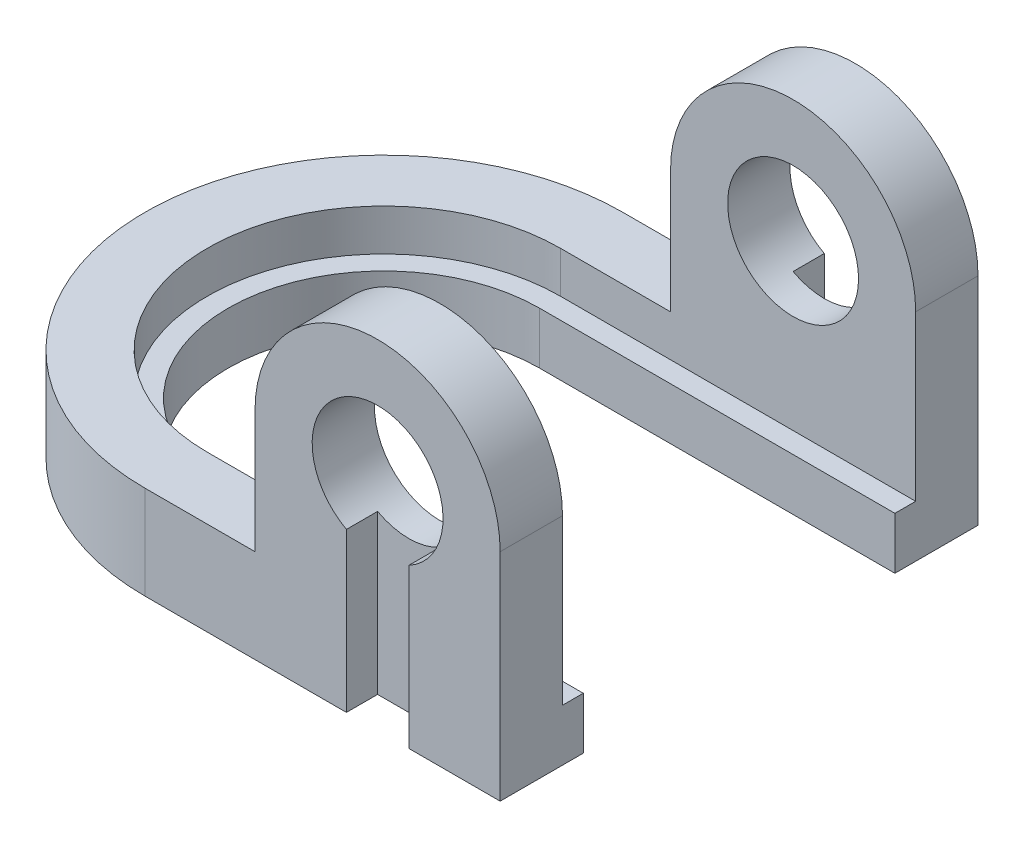
ISO-10303-21;
HEADER;
FILE_DESCRIPTION(('STEP AP214'),'2;1');
FILE_NAME('part.step','',(''),(''),'','','');
FILE_SCHEMA(('AUTOMOTIVE_DESIGN { 1 0 10303 214 1 1 1 1 }'));
ENDSEC;
DATA;
#1=APPLICATION_CONTEXT('core data for automotive mechanical design processes');
#2=APPLICATION_PROTOCOL_DEFINITION('international standard','automotive_design',2000,#1);
#3=PRODUCT_CONTEXT('',#1,'mechanical');
#4=PRODUCT('Part','Part','',(#3));
#5=PRODUCT_RELATED_PRODUCT_CATEGORY('part','',(#4));
#6=PRODUCT_DEFINITION_FORMATION('','',#4);
#7=PRODUCT_DEFINITION_CONTEXT('part definition',#1,'design');
#8=PRODUCT_DEFINITION('design','',#6,#7);
#9=PRODUCT_DEFINITION_SHAPE('','',#8);
#10=(LENGTH_UNIT() NAMED_UNIT(*) SI_UNIT(.MILLI.,.METRE.));
#11=(NAMED_UNIT(*) PLANE_ANGLE_UNIT() SI_UNIT($,.RADIAN.));
#12=(NAMED_UNIT(*) SI_UNIT($,.STERADIAN.) SOLID_ANGLE_UNIT());
#13=UNCERTAINTY_MEASURE_WITH_UNIT(LENGTH_MEASURE(1.E-05),#10,'distance_accuracy_value','');
#14=(GEOMETRIC_REPRESENTATION_CONTEXT(3) GLOBAL_UNCERTAINTY_ASSIGNED_CONTEXT((#13)) GLOBAL_UNIT_ASSIGNED_CONTEXT((#10,
#11,#12)) REPRESENTATION_CONTEXT('',''));
#15=CARTESIAN_POINT('',(0.,0.,0.));
#16=DIRECTION('',(0.,0.,1.));
#17=DIRECTION('',(1.,0.,0.));
#18=AXIS2_PLACEMENT_3D('',#15,#16,#17);
#19=CARTESIAN_POINT('',(0.,25.,115.));
#20=DIRECTION('',(0.,0.,-1.));
#21=DIRECTION('',(-1.,0.,0.));
#22=AXIS2_PLACEMENT_3D('',#19,#20,#21);
#23=PLANE('',#22);
#24=DIRECTION('',(0.,-1.,0.));
#25=VECTOR('',#24,1.);
#26=CARTESIAN_POINT('',(127.,-86.4238975695762,115.));
#27=LINE('',#26,#25);
#28=CARTESIAN_POINT('',(127.,76.3007220310709,115.));
#29=VERTEX_POINT('',#28);
#30=CARTESIAN_POINT('',(127.,0.,115.));
#31=VERTEX_POINT('',#30);
#32=EDGE_CURVE('E204',#29,#31,#27,.T.);
#33=ORIENTED_EDGE('',*,*,#32,.T.);
#34=DIRECTION('',(1.,0.,0.));
#35=VECTOR('',#34,1.);
#36=CARTESIAN_POINT('',(0.,0.,115.));
#37=LINE('',#36,#35);
#38=CARTESIAN_POINT('',(171.,0.,115.));
#39=VERTEX_POINT('',#38);
#40=EDGE_CURVE('E352',#31,#39,#37,.T.);
#41=ORIENTED_EDGE('',*,*,#40,.T.);
#42=DIRECTION('',(0.,-1.,0.));
#43=VECTOR('',#42,1.);
#44=CARTESIAN_POINT('',(171.,25.,115.));
#45=LINE('',#44,#43);
#46=CARTESIAN_POINT('',(171.,104.,115.));
#47=VERTEX_POINT('',#46);
#48=EDGE_CURVE('E332',#47,#39,#45,.T.);
#49=ORIENTED_EDGE('',*,*,#48,.F.);
#50=CARTESIAN_POINT('',(112.,104.,115.));
#51=DIRECTION('',(0.,0.,1.));
#52=DIRECTION('',(1.,0.,0.));
#53=AXIS2_PLACEMENT_3D('',#50,#51,#52);
#54=CIRCLE('',#53,59.);
#55=CARTESIAN_POINT('',(53.,104.,115.));
#56=VERTEX_POINT('',#55);
#57=EDGE_CURVE('E234',#47,#56,#54,.T.);
#58=ORIENTED_EDGE('',*,*,#57,.T.);
#59=DIRECTION('',(0.,-1.,0.));
#60=VECTOR('',#59,1.);
#61=CARTESIAN_POINT('',(53.,25.,115.));
#62=LINE('',#61,#60);
#63=CARTESIAN_POINT('',(53.,45.,115.));
#64=VERTEX_POINT('',#63);
#65=EDGE_CURVE('E231',#56,#64,#62,.T.);
#66=ORIENTED_EDGE('',*,*,#65,.T.);
#67=DIRECTION('',(1.,0.,0.));
#68=VECTOR('',#67,1.);
#69=CARTESIAN_POINT('',(0.,45.,115.));
#70=LINE('',#69,#68);
#71=CARTESIAN_POINT('',(0.,45.,115.));
#72=VERTEX_POINT('',#71);
#73=EDGE_CURVE('E288',#72,#64,#70,.T.);
#74=ORIENTED_EDGE('',*,*,#73,.F.);
#75=DIRECTION('',(0.,-1.,0.));
#76=VECTOR('',#75,1.);
#77=CARTESIAN_POINT('',(0.,25.,115.));
#78=LINE('',#77,#76);
#79=CARTESIAN_POINT('',(0.,0.,115.));
#80=VERTEX_POINT('',#79);
#81=EDGE_CURVE('E356',#72,#80,#78,.T.);
#82=ORIENTED_EDGE('',*,*,#81,.T.);
#83=CARTESIAN_POINT('',(97.,0.,115.));
#84=VERTEX_POINT('',#83);
#85=EDGE_CURVE('E321',#80,#84,#37,.T.);
#86=ORIENTED_EDGE('',*,*,#85,.T.);
#87=DIRECTION('',(0.,1.,0.));
#88=VECTOR('',#87,1.);
#89=CARTESIAN_POINT('',(97.,-86.4238975695762,115.));
#90=LINE('',#89,#88);
#91=CARTESIAN_POINT('',(97.,76.3007220310709,115.));
#92=VERTEX_POINT('',#91);
#93=EDGE_CURVE('E212',#84,#92,#90,.T.);
#94=ORIENTED_EDGE('',*,*,#93,.T.);
#95=CARTESIAN_POINT('',(112.,104.,115.));
#96=DIRECTION('',(0.,0.,1.));
#97=DIRECTION('',(1.,0.,0.));
#98=AXIS2_PLACEMENT_3D('',#95,#96,#97);
#99=CIRCLE('',#98,31.5);
#100=EDGE_CURVE('E218',#29,#92,#99,.T.);
#101=ORIENTED_EDGE('',*,*,#100,.F.);
#102=EDGE_LOOP('',(#33,#41,#49,#58,#66,#74,#82,#86,#94,#101));
#103=FACE_BOUND('',#102,.T.);
#104=ADVANCED_FACE('F43',(#103),#23,.F.);
#105=CARTESIAN_POINT('',(0.,0.,0.));
#106=DIRECTION('',(0.,1.,0.));
#107=DIRECTION('',(0.,0.,1.));
#108=AXIS2_PLACEMENT_3D('',#105,#106,#107);
#109=PLANE('',#108);
#110=DIRECTION('',(0.,0.,1.));
#111=VECTOR('',#110,1.);
#112=CARTESIAN_POINT('',(127.,0.,0.));
#113=LINE('',#112,#111);
#114=CARTESIAN_POINT('',(127.,0.,100.));
#115=VERTEX_POINT('',#114);
#116=EDGE_CURVE('E208',#115,#31,#113,.T.);
#117=ORIENTED_EDGE('',*,*,#116,.F.);
#118=DIRECTION('',(1.,0.,0.));
#119=VECTOR('',#118,1.);
#120=CARTESIAN_POINT('',(0.,0.,100.));
#121=LINE('',#120,#119);
#122=CARTESIAN_POINT('',(97.,0.,100.));
#123=VERTEX_POINT('',#122);
#124=EDGE_CURVE('E394',#123,#115,#121,.T.);
#125=ORIENTED_EDGE('',*,*,#124,.F.);
#126=DIRECTION('',(0.,0.,-1.));
#127=VECTOR('',#126,1.);
#128=CARTESIAN_POINT('',(97.,0.,0.));
#129=LINE('',#128,#127);
#130=EDGE_CURVE('E392',#84,#123,#129,.T.);
#131=ORIENTED_EDGE('',*,*,#130,.F.);
#132=ORIENTED_EDGE('',*,*,#85,.F.);
#133=CARTESIAN_POINT('',(0.,0.,0.));
#134=DIRECTION('',(0.,1.,0.));
#135=DIRECTION('',(0.,0.,1.));
#136=AXIS2_PLACEMENT_3D('',#133,#134,#135);
#137=CIRCLE('',#136,115.);
#138=CARTESIAN_POINT('',(0.,0.,-115.));
#139=VERTEX_POINT('',#138);
#140=EDGE_CURVE('E350',#139,#80,#137,.T.);
#141=ORIENTED_EDGE('',*,*,#140,.F.);
#142=DIRECTION('',(1.,0.,0.));
#143=VECTOR('',#142,1.);
#144=CARTESIAN_POINT('',(0.,0.,-115.));
#145=LINE('',#144,#143);
#146=CARTESIAN_POINT('',(97.,0.,-115.));
#147=VERTEX_POINT('',#146);
#148=EDGE_CURVE('E347',#139,#147,#145,.T.);
#149=ORIENTED_EDGE('',*,*,#148,.T.);
#150=DIRECTION('',(0.,0.,1.));
#151=VECTOR('',#150,1.);
#152=CARTESIAN_POINT('',(97.,0.,0.));
#153=LINE('',#152,#151);
#154=CARTESIAN_POINT('',(97.,0.,-100.));
#155=VERTEX_POINT('',#154);
#156=EDGE_CURVE('E253',#147,#155,#153,.T.);
#157=ORIENTED_EDGE('',*,*,#156,.T.);
#158=DIRECTION('',(-1.,0.,0.));
#159=VECTOR('',#158,1.);
#160=CARTESIAN_POINT('',(0.,0.,-100.));
#161=LINE('',#160,#159);
#162=CARTESIAN_POINT('',(127.,0.,-100.));
#163=VERTEX_POINT('',#162);
#164=EDGE_CURVE('E249',#163,#155,#161,.T.);
#165=ORIENTED_EDGE('',*,*,#164,.F.);
#166=DIRECTION('',(0.,0.,-1.));
#167=VECTOR('',#166,1.);
#168=CARTESIAN_POINT('',(127.,0.,0.));
#169=LINE('',#168,#167);
#170=CARTESIAN_POINT('',(127.,0.,-115.));
#171=VERTEX_POINT('',#170);
#172=EDGE_CURVE('E256',#163,#171,#169,.T.);
#173=ORIENTED_EDGE('',*,*,#172,.T.);
#174=CARTESIAN_POINT('',(171.,0.,-115.));
#175=VERTEX_POINT('',#174);
#176=EDGE_CURVE('E346',#171,#175,#145,.T.);
#177=ORIENTED_EDGE('',*,*,#176,.T.);
#178=DIRECTION('',(0.,0.,1.));
#179=VECTOR('',#178,1.);
#180=CARTESIAN_POINT('',(171.,0.,0.));
#181=LINE('',#180,#179);
#182=CARTESIAN_POINT('',(171.,0.,-75.));
#183=VERTEX_POINT('',#182);
#184=EDGE_CURVE('E344',#175,#183,#181,.T.);
#185=ORIENTED_EDGE('',*,*,#184,.T.);
#186=DIRECTION('',(1.,0.,0.));
#187=VECTOR('',#186,1.);
#188=CARTESIAN_POINT('',(0.,0.,-75.));
#189=LINE('',#188,#187);
#190=CARTESIAN_POINT('',(0.,0.,-75.));
#191=VERTEX_POINT('',#190);
#192=EDGE_CURVE('E341',#191,#183,#189,.T.);
#193=ORIENTED_EDGE('',*,*,#192,.F.);
#194=CARTESIAN_POINT('',(0.,0.,0.));
#195=DIRECTION('',(0.,1.,0.));
#196=DIRECTION('',(0.,0.,1.));
#197=AXIS2_PLACEMENT_3D('',#194,#195,#196);
#198=CIRCLE('',#197,75.);
#199=CARTESIAN_POINT('',(0.,0.,75.));
#200=VERTEX_POINT('',#199);
#201=EDGE_CURVE('E338',#191,#200,#198,.T.);
#202=ORIENTED_EDGE('',*,*,#201,.T.);
#203=DIRECTION('',(1.,0.,0.));
#204=VECTOR('',#203,1.);
#205=CARTESIAN_POINT('',(0.,0.,75.));
#206=LINE('',#205,#204);
#207=CARTESIAN_POINT('',(171.,0.,75.));
#208=VERTEX_POINT('',#207);
#209=EDGE_CURVE('E335',#200,#208,#206,.T.);
#210=ORIENTED_EDGE('',*,*,#209,.T.);
#211=DIRECTION('',(0.,0.,1.));
#212=VECTOR('',#211,1.);
#213=CARTESIAN_POINT('',(171.,0.,0.));
#214=LINE('',#213,#212);
#215=EDGE_CURVE('E316',#208,#39,#214,.T.);
#216=ORIENTED_EDGE('',*,*,#215,.T.);
#217=ORIENTED_EDGE('',*,*,#40,.F.);
#218=EDGE_LOOP('',(#117,#125,#131,#132,#141,#149,#157,#165,#173,#177,#185,#193,#202,#210,#216,#217));
#219=FACE_BOUND('',#218,.T.);
#220=ADVANCED_FACE('F400',(#219),#109,.F.);
#221=CARTESIAN_POINT('',(112.,104.,115.));
#222=DIRECTION('',(0.,0.,-1.));
#223=DIRECTION('',(-1.,0.,0.));
#224=AXIS2_PLACEMENT_3D('',#221,#222,#223);
#225=CYLINDRICAL_SURFACE('',#224,31.5);
#226=CARTESIAN_POINT('',(112.,104.,85.));
#227=DIRECTION('',(0.,0.,1.));
#228=DIRECTION('',(1.,0.,0.));
#229=AXIS2_PLACEMENT_3D('',#226,#227,#228);
#230=CIRCLE('',#229,31.5);
#231=CARTESIAN_POINT('',(143.5,104.,85.));
#232=VERTEX_POINT('',#231);
#233=EDGE_CURVE('E222',#232,#232,#230,.T.);
#234=ORIENTED_EDGE('',*,*,#233,.F.);
#235=EDGE_LOOP('',(#234));
#236=FACE_BOUND('',#235,.T.);
#237=CARTESIAN_POINT('',(112.,104.,100.));
#238=DIRECTION('',(0.,0.,1.));
#239=DIRECTION('',(1.,0.,0.));
#240=AXIS2_PLACEMENT_3D('',#237,#238,#239);
#241=CIRCLE('',#240,31.5);
#242=CARTESIAN_POINT('',(97.,76.3007220310709,100.));
#243=VERTEX_POINT('',#242);
#244=CARTESIAN_POINT('',(127.,76.3007220310709,100.));
#245=VERTEX_POINT('',#244);
#246=EDGE_CURVE('E219',#243,#245,#241,.T.);
#247=ORIENTED_EDGE('',*,*,#246,.T.);
#248=DIRECTION('',(0.,0.,-1.));
#249=VECTOR('',#248,1.);
#250=CARTESIAN_POINT('',(127.,76.3007220310709,115.));
#251=LINE('',#250,#249);
#252=EDGE_CURVE('E11',#245,#29,#251,.F.);
#253=ORIENTED_EDGE('',*,*,#252,.T.);
#254=ORIENTED_EDGE('',*,*,#100,.T.);
#255=DIRECTION('',(0.,0.,-1.));
#256=VECTOR('',#255,1.);
#257=CARTESIAN_POINT('',(97.,76.3007220310709,115.));
#258=LINE('',#257,#256);
#259=EDGE_CURVE('E51',#92,#243,#258,.T.);
#260=ORIENTED_EDGE('',*,*,#259,.T.);
#261=EDGE_LOOP('',(#247,#253,#254,#260));
#262=FACE_BOUND('',#261,.T.);
#263=ADVANCED_FACE('F216',(#236,#262),#225,.F.);
#264=CARTESIAN_POINT('',(0.,45.,0.));
#265=DIRECTION('',(0.,1.,0.));
#266=DIRECTION('',(0.,0.,1.));
#267=AXIS2_PLACEMENT_3D('',#264,#265,#266);
#268=PLANE('',#267);
#269=ORIENTED_EDGE('',*,*,#73,.T.);
#270=DIRECTION('',(0.,0.,-1.));
#271=VECTOR('',#270,1.);
#272=CARTESIAN_POINT('',(53.,45.,0.));
#273=LINE('',#272,#271);
#274=CARTESIAN_POINT('',(53.,45.,85.));
#275=VERTEX_POINT('',#274);
#276=EDGE_CURVE('E384',#64,#275,#273,.T.);
#277=ORIENTED_EDGE('',*,*,#276,.T.);
#278=DIRECTION('',(1.,0.,0.));
#279=VECTOR('',#278,1.);
#280=CARTESIAN_POINT('',(0.,45.,85.));
#281=LINE('',#280,#279);
#282=CARTESIAN_POINT('',(0.,45.,85.));
#283=VERTEX_POINT('',#282);
#284=EDGE_CURVE('E291',#283,#275,#281,.T.);
#285=ORIENTED_EDGE('',*,*,#284,.F.);
#286=CARTESIAN_POINT('',(0.,45.,0.));
#287=DIRECTION('',(0.,1.,0.));
#288=DIRECTION('',(0.,0.,1.));
#289=AXIS2_PLACEMENT_3D('',#286,#287,#288);
#290=CIRCLE('',#289,85.);
#291=CARTESIAN_POINT('',(0.,45.,-85.));
#292=VERTEX_POINT('',#291);
#293=EDGE_CURVE('E294',#292,#283,#290,.T.);
#294=ORIENTED_EDGE('',*,*,#293,.F.);
#295=DIRECTION('',(1.,0.,0.));
#296=VECTOR('',#295,1.);
#297=CARTESIAN_POINT('',(0.,45.,-85.));
#298=LINE('',#297,#296);
#299=CARTESIAN_POINT('',(53.,45.,-85.));
#300=VERTEX_POINT('',#299);
#301=EDGE_CURVE('E297',#292,#300,#298,.T.);
#302=ORIENTED_EDGE('',*,*,#301,.T.);
#303=DIRECTION('',(0.,0.,1.));
#304=VECTOR('',#303,1.);
#305=CARTESIAN_POINT('',(53.,45.,0.));
#306=LINE('',#305,#304);
#307=CARTESIAN_POINT('',(53.,45.,-115.));
#308=VERTEX_POINT('',#307);
#309=EDGE_CURVE('E373',#308,#300,#306,.T.);
#310=ORIENTED_EDGE('',*,*,#309,.F.);
#311=DIRECTION('',(1.,0.,0.));
#312=VECTOR('',#311,1.);
#313=CARTESIAN_POINT('',(0.,45.,-115.));
#314=LINE('',#313,#312);
#315=CARTESIAN_POINT('',(0.,45.,-115.));
#316=VERTEX_POINT('',#315);
#317=EDGE_CURVE('E280',#316,#308,#314,.T.);
#318=ORIENTED_EDGE('',*,*,#317,.F.);
#319=CARTESIAN_POINT('',(0.,45.,0.));
#320=DIRECTION('',(0.,1.,0.));
#321=DIRECTION('',(0.,0.,1.));
#322=AXIS2_PLACEMENT_3D('',#319,#320,#321);
#323=CIRCLE('',#322,115.);
#324=EDGE_CURVE('E285',#316,#72,#323,.T.);
#325=ORIENTED_EDGE('',*,*,#324,.T.);
#326=EDGE_LOOP('',(#269,#277,#285,#294,#302,#310,#318,#325));
#327=FACE_BOUND('',#326,.T.);
#328=ADVANCED_FACE('F412',(#327),#268,.T.);
#329=CARTESIAN_POINT('',(171.,25.,0.));
#330=DIRECTION('',(1.,0.,0.));
#331=DIRECTION('',(0.,0.,-1.));
#332=AXIS2_PLACEMENT_3D('',#329,#330,#331);
#333=PLANE('',#332);
#334=ORIENTED_EDGE('',*,*,#48,.T.);
#335=ORIENTED_EDGE('',*,*,#215,.F.);
#336=DIRECTION('',(0.,-1.,0.));
#337=VECTOR('',#336,1.);
#338=CARTESIAN_POINT('',(171.,25.,75.));
#339=LINE('',#338,#337);
#340=CARTESIAN_POINT('',(171.,25.,75.));
#341=VERTEX_POINT('',#340);
#342=EDGE_CURVE('E371',#341,#208,#339,.T.);
#343=ORIENTED_EDGE('',*,*,#342,.F.);
#344=DIRECTION('',(0.,0.,1.));
#345=VECTOR('',#344,1.);
#346=CARTESIAN_POINT('',(171.,25.,0.));
#347=LINE('',#346,#345);
#348=CARTESIAN_POINT('',(171.,25.,85.));
#349=VERTEX_POINT('',#348);
#350=EDGE_CURVE('E317',#341,#349,#347,.T.);
#351=ORIENTED_EDGE('',*,*,#350,.T.);
#352=DIRECTION('',(0.,-1.,0.));
#353=VECTOR('',#352,1.);
#354=CARTESIAN_POINT('',(171.,45.,85.));
#355=LINE('',#354,#353);
#356=CARTESIAN_POINT('',(171.,104.,85.));
#357=VERTEX_POINT('',#356);
#358=EDGE_CURVE('E307',#357,#349,#355,.T.);
#359=ORIENTED_EDGE('',*,*,#358,.F.);
#360=DIRECTION('',(0.,0.,-1.));
#361=VECTOR('',#360,1.);
#362=CARTESIAN_POINT('',(171.,104.,115.));
#363=LINE('',#362,#361);
#364=EDGE_CURVE('E238',#47,#357,#363,.T.);
#365=ORIENTED_EDGE('',*,*,#364,.F.);
#366=EDGE_LOOP('',(#334,#335,#343,#351,#359,#365));
#367=FACE_BOUND('',#366,.T.);
#368=ADVANCED_FACE('F45',(#367),#333,.T.);
#369=CARTESIAN_POINT('',(0.,25.,75.));
#370=DIRECTION('',(0.,0.,-1.));
#371=DIRECTION('',(-1.,0.,0.));
#372=AXIS2_PLACEMENT_3D('',#369,#370,#371);
#373=PLANE('',#372);
#374=ORIENTED_EDGE('',*,*,#209,.F.);
#375=DIRECTION('',(0.,-1.,0.));
#376=VECTOR('',#375,1.);
#377=CARTESIAN_POINT('',(0.,25.,75.));
#378=LINE('',#377,#376);
#379=CARTESIAN_POINT('',(0.,25.,75.));
#380=VERTEX_POINT('',#379);
#381=EDGE_CURVE('E369',#380,#200,#378,.T.);
#382=ORIENTED_EDGE('',*,*,#381,.F.);
#383=DIRECTION('',(1.,0.,0.));
#384=VECTOR('',#383,1.);
#385=CARTESIAN_POINT('',(0.,25.,75.));
#386=LINE('',#385,#384);
#387=EDGE_CURVE('E320',#380,#341,#386,.T.);
#388=ORIENTED_EDGE('',*,*,#387,.T.);
#389=ORIENTED_EDGE('',*,*,#342,.T.);
#390=EDGE_LOOP('',(#374,#382,#388,#389));
#391=FACE_BOUND('',#390,.T.);
#392=ADVANCED_FACE('F458',(#391),#373,.T.);
#393=CARTESIAN_POINT('',(0.,25.,0.));
#394=DIRECTION('',(0.,-1.,0.));
#395=DIRECTION('',(0.,0.,-1.));
#396=AXIS2_PLACEMENT_3D('',#393,#394,#395);
#397=CYLINDRICAL_SURFACE('',#396,75.);
#398=ORIENTED_EDGE('',*,*,#201,.F.);
#399=DIRECTION('',(0.,-1.,0.));
#400=VECTOR('',#399,1.);
#401=CARTESIAN_POINT('',(0.,25.,-75.));
#402=LINE('',#401,#400);
#403=CARTESIAN_POINT('',(0.,25.,-75.));
#404=VERTEX_POINT('',#403);
#405=EDGE_CURVE('E367',#404,#191,#402,.T.);
#406=ORIENTED_EDGE('',*,*,#405,.F.);
#407=CARTESIAN_POINT('',(0.,25.,0.));
#408=DIRECTION('',(0.,1.,0.));
#409=DIRECTION('',(0.,0.,1.));
#410=AXIS2_PLACEMENT_3D('',#407,#408,#409);
#411=CIRCLE('',#410,75.);
#412=EDGE_CURVE('E324',#404,#380,#411,.T.);
#413=ORIENTED_EDGE('',*,*,#412,.T.);
#414=ORIENTED_EDGE('',*,*,#381,.T.);
#415=EDGE_LOOP('',(#398,#406,#413,#414));
#416=FACE_BOUND('',#415,.T.);
#417=ADVANCED_FACE('F452',(#416),#397,.F.);
#418=CARTESIAN_POINT('',(0.,25.,-75.));
#419=DIRECTION('',(0.,0.,-1.));
#420=DIRECTION('',(-1.,0.,0.));
#421=AXIS2_PLACEMENT_3D('',#418,#419,#420);
#422=PLANE('',#421);
#423=ORIENTED_EDGE('',*,*,#192,.T.);
#424=DIRECTION('',(0.,-1.,0.));
#425=VECTOR('',#424,1.);
#426=CARTESIAN_POINT('',(171.,25.,-75.));
#427=LINE('',#426,#425);
#428=CARTESIAN_POINT('',(171.,25.,-75.));
#429=VERTEX_POINT('',#428);
#430=EDGE_CURVE('E364',#429,#183,#427,.T.);
#431=ORIENTED_EDGE('',*,*,#430,.F.);
#432=DIRECTION('',(1.,0.,0.));
#433=VECTOR('',#432,1.);
#434=CARTESIAN_POINT('',(0.,25.,-75.));
#435=LINE('',#434,#433);
#436=EDGE_CURVE('E327',#404,#429,#435,.T.);
#437=ORIENTED_EDGE('',*,*,#436,.F.);
#438=ORIENTED_EDGE('',*,*,#405,.T.);
#439=EDGE_LOOP('',(#423,#431,#437,#438));
#440=FACE_BOUND('',#439,.T.);
#441=ADVANCED_FACE('F482',(#440),#422,.F.);
#442=CARTESIAN_POINT('',(171.,25.,0.));
#443=DIRECTION('',(1.,0.,0.));
#444=DIRECTION('',(0.,0.,-1.));
#445=AXIS2_PLACEMENT_3D('',#442,#443,#444);
#446=PLANE('',#445);
#447=ORIENTED_EDGE('',*,*,#184,.F.);
#448=DIRECTION('',(0.,-1.,0.));
#449=VECTOR('',#448,1.);
#450=CARTESIAN_POINT('',(171.,25.,-115.));
#451=LINE('',#450,#449);
#452=CARTESIAN_POINT('',(171.,104.,-115.));
#453=VERTEX_POINT('',#452);
#454=EDGE_CURVE('E361',#453,#175,#451,.T.);
#455=ORIENTED_EDGE('',*,*,#454,.F.);
#456=DIRECTION('',(0.,0.,1.));
#457=VECTOR('',#456,1.);
#458=CARTESIAN_POINT('',(171.,104.,-115.));
#459=LINE('',#458,#457);
#460=CARTESIAN_POINT('',(171.,104.,-85.));
#461=VERTEX_POINT('',#460);
#462=EDGE_CURVE('E273',#453,#461,#459,.T.);
#463=ORIENTED_EDGE('',*,*,#462,.T.);
#464=DIRECTION('',(0.,-1.,0.));
#465=VECTOR('',#464,1.);
#466=CARTESIAN_POINT('',(171.,45.,-85.));
#467=LINE('',#466,#465);
#468=CARTESIAN_POINT('',(171.,25.,-85.));
#469=VERTEX_POINT('',#468);
#470=EDGE_CURVE('E299',#461,#469,#467,.T.);
#471=ORIENTED_EDGE('',*,*,#470,.T.);
#472=DIRECTION('',(0.,0.,1.));
#473=VECTOR('',#472,1.);
#474=CARTESIAN_POINT('',(171.,25.,0.));
#475=LINE('',#474,#473);
#476=EDGE_CURVE('E330',#469,#429,#475,.T.);
#477=ORIENTED_EDGE('',*,*,#476,.T.);
#478=ORIENTED_EDGE('',*,*,#430,.T.);
#479=EDGE_LOOP('',(#447,#455,#463,#471,#477,#478));
#480=FACE_BOUND('',#479,.T.);
#481=ADVANCED_FACE('F446',(#480),#446,.T.);
#482=CARTESIAN_POINT('',(0.,25.,-115.));
#483=DIRECTION('',(0.,0.,-1.));
#484=DIRECTION('',(-1.,0.,0.));
#485=AXIS2_PLACEMENT_3D('',#482,#483,#484);
#486=PLANE('',#485);
#487=DIRECTION('',(0.,-1.,0.));
#488=VECTOR('',#487,1.);
#489=CARTESIAN_POINT('',(127.,-86.4238975695762,-115.));
#490=LINE('',#489,#488);
#491=CARTESIAN_POINT('',(127.,76.3007220310709,-115.));
#492=VERTEX_POINT('',#491);
#493=EDGE_CURVE('E241',#492,#171,#490,.T.);
#494=ORIENTED_EDGE('',*,*,#493,.F.);
#495=CARTESIAN_POINT('',(112.,104.,-115.));
#496=DIRECTION('',(0.,0.,1.));
#497=DIRECTION('',(1.,0.,0.));
#498=AXIS2_PLACEMENT_3D('',#495,#496,#497);
#499=CIRCLE('',#498,31.5);
#500=CARTESIAN_POINT('',(97.,76.3007220310709,-115.));
#501=VERTEX_POINT('',#500);
#502=EDGE_CURVE('E260',#492,#501,#499,.T.);
#503=ORIENTED_EDGE('',*,*,#502,.T.);
#504=DIRECTION('',(0.,1.,0.));
#505=VECTOR('',#504,1.);
#506=CARTESIAN_POINT('',(97.,-86.4238975695762,-115.));
#507=LINE('',#506,#505);
#508=EDGE_CURVE('E247',#147,#501,#507,.T.);
#509=ORIENTED_EDGE('',*,*,#508,.F.);
#510=ORIENTED_EDGE('',*,*,#148,.F.);
#511=DIRECTION('',(0.,-1.,0.));
#512=VECTOR('',#511,1.);
#513=CARTESIAN_POINT('',(0.,25.,-115.));
#514=LINE('',#513,#512);
#515=EDGE_CURVE('E359',#316,#139,#514,.T.);
#516=ORIENTED_EDGE('',*,*,#515,.F.);
#517=ORIENTED_EDGE('',*,*,#317,.T.);
#518=DIRECTION('',(0.,-1.,0.));
#519=VECTOR('',#518,1.);
#520=CARTESIAN_POINT('',(53.,25.,-115.));
#521=LINE('',#520,#519);
#522=CARTESIAN_POINT('',(53.,104.,-115.));
#523=VERTEX_POINT('',#522);
#524=EDGE_CURVE('E269',#523,#308,#521,.T.);
#525=ORIENTED_EDGE('',*,*,#524,.F.);
#526=CARTESIAN_POINT('',(112.,104.,-115.));
#527=DIRECTION('',(0.,0.,1.));
#528=DIRECTION('',(1.,0.,0.));
#529=AXIS2_PLACEMENT_3D('',#526,#527,#528);
#530=CIRCLE('',#529,59.);
#531=EDGE_CURVE('E266',#453,#523,#530,.T.);
#532=ORIENTED_EDGE('',*,*,#531,.F.);
#533=ORIENTED_EDGE('',*,*,#454,.T.);
#534=ORIENTED_EDGE('',*,*,#176,.F.);
#535=EDGE_LOOP('',(#494,#503,#509,#510,#516,#517,#525,#532,#533,#534));
#536=FACE_BOUND('',#535,.T.);
#537=ADVANCED_FACE('F424',(#536),#486,.T.);
#538=CARTESIAN_POINT('',(0.,25.,0.));
#539=DIRECTION('',(0.,-1.,0.));
#540=DIRECTION('',(0.,0.,-1.));
#541=AXIS2_PLACEMENT_3D('',#538,#539,#540);
#542=CYLINDRICAL_SURFACE('',#541,115.);
#543=ORIENTED_EDGE('',*,*,#140,.T.);
#544=ORIENTED_EDGE('',*,*,#81,.F.);
#545=ORIENTED_EDGE('',*,*,#324,.F.);
#546=ORIENTED_EDGE('',*,*,#515,.T.);
#547=EDGE_LOOP('',(#543,#544,#545,#546));
#548=FACE_BOUND('',#547,.T.);
#549=ADVANCED_FACE('F417',(#548),#542,.T.);
#550=CARTESIAN_POINT('',(0.,25.,0.));
#551=DIRECTION('',(0.,1.,0.));
#552=DIRECTION('',(0.,0.,1.));
#553=AXIS2_PLACEMENT_3D('',#550,#551,#552);
#554=PLANE('',#553);
#555=DIRECTION('',(-1.,0.,0.));
#556=VECTOR('',#555,1.);
#557=CARTESIAN_POINT('',(0.,25.,85.));
#558=LINE('',#557,#556);
#559=CARTESIAN_POINT('',(0.,25.,85.));
#560=VERTEX_POINT('',#559);
#561=EDGE_CURVE('E314',#349,#560,#558,.T.);
#562=ORIENTED_EDGE('',*,*,#561,.F.);
#563=ORIENTED_EDGE('',*,*,#350,.F.);
#564=ORIENTED_EDGE('',*,*,#387,.F.);
#565=ORIENTED_EDGE('',*,*,#412,.F.);
#566=ORIENTED_EDGE('',*,*,#436,.T.);
#567=ORIENTED_EDGE('',*,*,#476,.F.);
#568=DIRECTION('',(-1.,0.,0.));
#569=VECTOR('',#568,1.);
#570=CARTESIAN_POINT('',(0.,25.,-85.));
#571=LINE('',#570,#569);
#572=CARTESIAN_POINT('',(0.,25.,-85.));
#573=VERTEX_POINT('',#572);
#574=EDGE_CURVE('E309',#469,#573,#571,.T.);
#575=ORIENTED_EDGE('',*,*,#574,.T.);
#576=CARTESIAN_POINT('',(0.,25.,0.));
#577=DIRECTION('',(0.,1.,0.));
#578=DIRECTION('',(0.,0.,1.));
#579=AXIS2_PLACEMENT_3D('',#576,#577,#578);
#580=CIRCLE('',#579,85.);
#581=EDGE_CURVE('E311',#560,#573,#580,.F.);
#582=ORIENTED_EDGE('',*,*,#581,.F.);
#583=EDGE_LOOP('',(#562,#563,#564,#565,#566,#567,#575,#582));
#584=FACE_BOUND('',#583,.T.);
#585=ADVANCED_FACE('F462',(#584),#554,.T.);
#586=CARTESIAN_POINT('',(0.,45.,85.));
#587=DIRECTION('',(0.,0.,-1.));
#588=DIRECTION('',(-1.,0.,0.));
#589=AXIS2_PLACEMENT_3D('',#586,#587,#588);
#590=PLANE('',#589);
#591=ORIENTED_EDGE('',*,*,#561,.T.);
#592=DIRECTION('',(0.,-1.,0.));
#593=VECTOR('',#592,1.);
#594=CARTESIAN_POINT('',(0.,45.,85.));
#595=LINE('',#594,#593);
#596=EDGE_CURVE('E304',#283,#560,#595,.T.);
#597=ORIENTED_EDGE('',*,*,#596,.F.);
#598=ORIENTED_EDGE('',*,*,#284,.T.);
#599=DIRECTION('',(0.,-1.,0.));
#600=VECTOR('',#599,1.);
#601=CARTESIAN_POINT('',(53.,25.,85.));
#602=LINE('',#601,#600);
#603=CARTESIAN_POINT('',(53.,104.,85.));
#604=VERTEX_POINT('',#603);
#605=EDGE_CURVE('E66',#604,#275,#602,.T.);
#606=ORIENTED_EDGE('',*,*,#605,.F.);
#607=CARTESIAN_POINT('',(112.,104.,85.));
#608=DIRECTION('',(0.,0.,1.));
#609=DIRECTION('',(1.,0.,0.));
#610=AXIS2_PLACEMENT_3D('',#607,#608,#609);
#611=CIRCLE('',#610,59.);
#612=EDGE_CURVE('E224',#357,#604,#611,.T.);
#613=ORIENTED_EDGE('',*,*,#612,.F.);
#614=ORIENTED_EDGE('',*,*,#358,.T.);
#615=EDGE_LOOP('',(#591,#597,#598,#606,#613,#614));
#616=FACE_BOUND('',#615,.T.);
#617=ORIENTED_EDGE('',*,*,#233,.T.);
#618=EDGE_LOOP('',(#617));
#619=FACE_BOUND('',#618,.T.);
#620=ADVANCED_FACE('F465',(#616,#619),#590,.T.);
#621=CARTESIAN_POINT('',(0.,45.,0.));
#622=DIRECTION('',(0.,-1.,0.));
#623=DIRECTION('',(0.,0.,-1.));
#624=AXIS2_PLACEMENT_3D('',#621,#622,#623);
#625=CYLINDRICAL_SURFACE('',#624,85.);
#626=ORIENTED_EDGE('',*,*,#596,.T.);
#627=ORIENTED_EDGE('',*,*,#581,.T.);
#628=DIRECTION('',(0.,-1.,0.));
#629=VECTOR('',#628,1.);
#630=CARTESIAN_POINT('',(0.,45.,-85.));
#631=LINE('',#630,#629);
#632=EDGE_CURVE('E301',#292,#573,#631,.T.);
#633=ORIENTED_EDGE('',*,*,#632,.F.);
#634=ORIENTED_EDGE('',*,*,#293,.T.);
#635=EDGE_LOOP('',(#626,#627,#633,#634));
#636=FACE_BOUND('',#635,.T.);
#637=ADVANCED_FACE('F468',(#636),#625,.F.);
#638=CARTESIAN_POINT('',(0.,45.,-85.));
#639=DIRECTION('',(0.,0.,-1.));
#640=DIRECTION('',(-1.,0.,0.));
#641=AXIS2_PLACEMENT_3D('',#638,#639,#640);
#642=PLANE('',#641);
#643=ORIENTED_EDGE('',*,*,#632,.T.);
#644=ORIENTED_EDGE('',*,*,#574,.F.);
#645=ORIENTED_EDGE('',*,*,#470,.F.);
#646=CARTESIAN_POINT('',(112.,104.,-85.));
#647=DIRECTION('',(0.,0.,1.));
#648=DIRECTION('',(1.,0.,0.));
#649=AXIS2_PLACEMENT_3D('',#646,#647,#648);
#650=CIRCLE('',#649,59.);
#651=CARTESIAN_POINT('',(53.,104.,-85.));
#652=VERTEX_POINT('',#651);
#653=EDGE_CURVE('E263',#461,#652,#650,.T.);
#654=ORIENTED_EDGE('',*,*,#653,.T.);
#655=DIRECTION('',(0.,-1.,0.));
#656=VECTOR('',#655,1.);
#657=CARTESIAN_POINT('',(53.,25.,-85.));
#658=LINE('',#657,#656);
#659=EDGE_CURVE('E270',#652,#300,#658,.T.);
#660=ORIENTED_EDGE('',*,*,#659,.T.);
#661=ORIENTED_EDGE('',*,*,#301,.F.);
#662=EDGE_LOOP('',(#643,#644,#645,#654,#660,#661));
#663=FACE_BOUND('',#662,.T.);
#664=CARTESIAN_POINT('',(112.,104.,-85.));
#665=DIRECTION('',(0.,0.,1.));
#666=DIRECTION('',(1.,0.,0.));
#667=AXIS2_PLACEMENT_3D('',#664,#665,#666);
#668=CIRCLE('',#667,31.5);
#669=CARTESIAN_POINT('',(143.5,104.,-85.));
#670=VERTEX_POINT('',#669);
#671=EDGE_CURVE('E259',#670,#670,#668,.T.);
#672=ORIENTED_EDGE('',*,*,#671,.F.);
#673=EDGE_LOOP('',(#672));
#674=FACE_BOUND('',#673,.T.);
#675=ADVANCED_FACE('F475',(#663,#674),#642,.F.);
#676=CARTESIAN_POINT('',(53.,25.,-115.));
#677=DIRECTION('',(-1.,0.,0.));
#678=DIRECTION('',(0.,-1.,0.));
#679=AXIS2_PLACEMENT_3D('',#676,#677,#678);
#680=PLANE('',#679);
#681=ORIENTED_EDGE('',*,*,#524,.T.);
#682=ORIENTED_EDGE('',*,*,#309,.T.);
#683=ORIENTED_EDGE('',*,*,#659,.F.);
#684=DIRECTION('',(0.,0.,1.));
#685=VECTOR('',#684,1.);
#686=CARTESIAN_POINT('',(53.,104.,-115.));
#687=LINE('',#686,#685);
#688=EDGE_CURVE('E278',#523,#652,#687,.T.);
#689=ORIENTED_EDGE('',*,*,#688,.F.);
#690=EDGE_LOOP('',(#681,#682,#683,#689));
#691=FACE_BOUND('',#690,.T.);
#692=ADVANCED_FACE('F474',(#691),#680,.T.);
#693=CARTESIAN_POINT('',(112.,104.,-115.));
#694=DIRECTION('',(0.,0.,1.));
#695=DIRECTION('',(1.,0.,0.));
#696=AXIS2_PLACEMENT_3D('',#693,#694,#695);
#697=CYLINDRICAL_SURFACE('',#696,59.);
#698=ORIENTED_EDGE('',*,*,#653,.F.);
#699=ORIENTED_EDGE('',*,*,#462,.F.);
#700=ORIENTED_EDGE('',*,*,#531,.T.);
#701=ORIENTED_EDGE('',*,*,#688,.T.);
#702=EDGE_LOOP('',(#698,#699,#700,#701));
#703=FACE_BOUND('',#702,.T.);
#704=ADVANCED_FACE('F480',(#703),#697,.T.);
#705=CARTESIAN_POINT('',(112.,104.,-115.));
#706=DIRECTION('',(0.,0.,1.));
#707=DIRECTION('',(1.,0.,0.));
#708=AXIS2_PLACEMENT_3D('',#705,#706,#707);
#709=CYLINDRICAL_SURFACE('',#708,31.5);
#710=ORIENTED_EDGE('',*,*,#502,.F.);
#711=DIRECTION('',(0.,0.,1.));
#712=VECTOR('',#711,1.);
#713=CARTESIAN_POINT('',(127.,76.3007220310709,-115.));
#714=LINE('',#713,#712);
#715=CARTESIAN_POINT('',(127.,76.3007220310709,-100.));
#716=VERTEX_POINT('',#715);
#717=EDGE_CURVE('E381',#492,#716,#714,.T.);
#718=ORIENTED_EDGE('',*,*,#717,.T.);
#719=CARTESIAN_POINT('',(112.,104.,-100.));
#720=DIRECTION('',(0.,0.,-1.));
#721=DIRECTION('',(-1.,0.,0.));
#722=AXIS2_PLACEMENT_3D('',#719,#720,#721);
#723=CIRCLE('',#722,31.5);
#724=CARTESIAN_POINT('',(97.,76.3007220310709,-100.));
#725=VERTEX_POINT('',#724);
#726=EDGE_CURVE('E376',#725,#716,#723,.F.);
#727=ORIENTED_EDGE('',*,*,#726,.F.);
#728=DIRECTION('',(0.,0.,1.));
#729=VECTOR('',#728,1.);
#730=CARTESIAN_POINT('',(97.,76.3007220310709,-115.));
#731=LINE('',#730,#729);
#732=EDGE_CURVE('E378',#725,#501,#731,.F.);
#733=ORIENTED_EDGE('',*,*,#732,.T.);
#734=EDGE_LOOP('',(#710,#718,#727,#733));
#735=FACE_BOUND('',#734,.T.);
#736=ORIENTED_EDGE('',*,*,#671,.T.);
#737=EDGE_LOOP('',(#736));
#738=FACE_BOUND('',#737,.T.);
#739=ADVANCED_FACE('F432',(#735,#738),#709,.F.);
#740=CARTESIAN_POINT('',(127.,-86.4238975695762,-100.));
#741=DIRECTION('',(1.,0.,0.));
#742=DIRECTION('',(0.,0.,-1.));
#743=AXIS2_PLACEMENT_3D('',#740,#741,#742);
#744=PLANE('',#743);
#745=DIRECTION('',(0.,-1.,0.));
#746=VECTOR('',#745,1.);
#747=CARTESIAN_POINT('',(127.,-86.4238975695762,-100.));
#748=LINE('',#747,#746);
#749=EDGE_CURVE('E243',#716,#163,#748,.T.);
#750=ORIENTED_EDGE('',*,*,#749,.F.);
#751=ORIENTED_EDGE('',*,*,#717,.F.);
#752=ORIENTED_EDGE('',*,*,#493,.T.);
#753=ORIENTED_EDGE('',*,*,#172,.F.);
#754=EDGE_LOOP('',(#750,#751,#752,#753));
#755=FACE_BOUND('',#754,.T.);
#756=ADVANCED_FACE('F439',(#755),#744,.F.);
#757=CARTESIAN_POINT('',(97.,-86.4238975695762,-100.));
#758=DIRECTION('',(-1.,0.,0.));
#759=DIRECTION('',(0.,0.,1.));
#760=AXIS2_PLACEMENT_3D('',#757,#758,#759);
#761=PLANE('',#760);
#762=ORIENTED_EDGE('',*,*,#508,.T.);
#763=ORIENTED_EDGE('',*,*,#732,.F.);
#764=DIRECTION('',(0.,1.,0.));
#765=VECTOR('',#764,1.);
#766=CARTESIAN_POINT('',(97.,-86.4238975695762,-100.));
#767=LINE('',#766,#765);
#768=EDGE_CURVE('E246',#155,#725,#767,.T.);
#769=ORIENTED_EDGE('',*,*,#768,.F.);
#770=ORIENTED_EDGE('',*,*,#156,.F.);
#771=EDGE_LOOP('',(#762,#763,#769,#770));
#772=FACE_BOUND('',#771,.T.);
#773=ADVANCED_FACE('F428',(#772),#761,.F.);
#774=CARTESIAN_POINT('',(0.,0.,-100.));
#775=DIRECTION('',(0.,0.,-1.));
#776=DIRECTION('',(-1.,0.,0.));
#777=AXIS2_PLACEMENT_3D('',#774,#775,#776);
#778=PLANE('',#777);
#779=ORIENTED_EDGE('',*,*,#164,.T.);
#780=ORIENTED_EDGE('',*,*,#768,.T.);
#781=ORIENTED_EDGE('',*,*,#726,.T.);
#782=ORIENTED_EDGE('',*,*,#749,.T.);
#783=EDGE_LOOP('',(#779,#780,#781,#782));
#784=FACE_BOUND('',#783,.T.);
#785=ADVANCED_FACE('F436',(#784),#778,.T.);
#786=CARTESIAN_POINT('',(112.,104.,115.));
#787=DIRECTION('',(0.,0.,-1.));
#788=DIRECTION('',(-1.,0.,0.));
#789=AXIS2_PLACEMENT_3D('',#786,#787,#788);
#790=CYLINDRICAL_SURFACE('',#789,59.);
#791=ORIENTED_EDGE('',*,*,#612,.T.);
#792=DIRECTION('',(0.,0.,-1.));
#793=VECTOR('',#792,1.);
#794=CARTESIAN_POINT('',(53.,104.,115.));
#795=LINE('',#794,#793);
#796=EDGE_CURVE('E235',#56,#604,#795,.T.);
#797=ORIENTED_EDGE('',*,*,#796,.F.);
#798=ORIENTED_EDGE('',*,*,#57,.F.);
#799=ORIENTED_EDGE('',*,*,#364,.T.);
#800=EDGE_LOOP('',(#791,#797,#798,#799));
#801=FACE_BOUND('',#800,.T.);
#802=ADVANCED_FACE('F407',(#801),#790,.T.);
#803=CARTESIAN_POINT('',(53.,25.,115.));
#804=DIRECTION('',(1.,0.,0.));
#805=DIRECTION('',(0.,1.,0.));
#806=AXIS2_PLACEMENT_3D('',#803,#804,#805);
#807=PLANE('',#806);
#808=ORIENTED_EDGE('',*,*,#276,.F.);
#809=ORIENTED_EDGE('',*,*,#65,.F.);
#810=ORIENTED_EDGE('',*,*,#796,.T.);
#811=ORIENTED_EDGE('',*,*,#605,.T.);
#812=EDGE_LOOP('',(#808,#809,#810,#811));
#813=FACE_BOUND('',#812,.T.);
#814=ADVANCED_FACE('F579',(#813),#807,.F.);
#815=CARTESIAN_POINT('',(127.,-86.4238975695762,100.));
#816=DIRECTION('',(-1.,0.,0.));
#817=DIRECTION('',(0.,0.,1.));
#818=AXIS2_PLACEMENT_3D('',#815,#816,#817);
#819=PLANE('',#818);
#820=ORIENTED_EDGE('',*,*,#116,.T.);
#821=ORIENTED_EDGE('',*,*,#32,.F.);
#822=ORIENTED_EDGE('',*,*,#252,.F.);
#823=DIRECTION('',(0.,-1.,0.));
#824=VECTOR('',#823,1.);
#825=CARTESIAN_POINT('',(127.,-86.4238975695762,100.));
#826=LINE('',#825,#824);
#827=EDGE_CURVE('E58',#245,#115,#826,.T.);
#828=ORIENTED_EDGE('',*,*,#827,.T.);
#829=EDGE_LOOP('',(#820,#821,#822,#828));
#830=FACE_BOUND('',#829,.T.);
#831=ADVANCED_FACE('F205',(#830),#819,.T.);
#832=CARTESIAN_POINT('',(97.,-86.4238975695762,100.));
#833=DIRECTION('',(1.,0.,0.));
#834=DIRECTION('',(0.,0.,-1.));
#835=AXIS2_PLACEMENT_3D('',#832,#833,#834);
#836=PLANE('',#835);
#837=ORIENTED_EDGE('',*,*,#130,.T.);
#838=DIRECTION('',(0.,1.,0.));
#839=VECTOR('',#838,1.);
#840=CARTESIAN_POINT('',(97.,-86.4238975695762,100.));
#841=LINE('',#840,#839);
#842=EDGE_CURVE('E391',#123,#243,#841,.T.);
#843=ORIENTED_EDGE('',*,*,#842,.T.);
#844=ORIENTED_EDGE('',*,*,#259,.F.);
#845=ORIENTED_EDGE('',*,*,#93,.F.);
#846=EDGE_LOOP('',(#837,#843,#844,#845));
#847=FACE_BOUND('',#846,.T.);
#848=ADVANCED_FACE('F388',(#847),#836,.T.);
#849=CARTESIAN_POINT('',(0.,0.,100.));
#850=DIRECTION('',(0.,0.,1.));
#851=DIRECTION('',(-1.,0.,0.));
#852=AXIS2_PLACEMENT_3D('',#849,#850,#851);
#853=PLANE('',#852);
#854=ORIENTED_EDGE('',*,*,#124,.T.);
#855=ORIENTED_EDGE('',*,*,#827,.F.);
#856=ORIENTED_EDGE('',*,*,#246,.F.);
#857=ORIENTED_EDGE('',*,*,#842,.F.);
#858=EDGE_LOOP('',(#854,#855,#856,#857));
#859=FACE_BOUND('',#858,.T.);
#860=ADVANCED_FACE('F639',(#859),#853,.T.);
#861=CLOSED_SHELL('',(#104,#220,#263,#328,#368,#392,#417,#441,#481,#537,#549,#585,#620,#637,
#675,#692,#704,#739,#756,#773,#785,#802,#814,#831,#848,#860));
#862=MANIFOLD_SOLID_BREP('B2',#861);
#863=ADVANCED_BREP_SHAPE_REPRESENTATION('',(#18,#862),#14);
#864=SHAPE_DEFINITION_REPRESENTATION(#9,#863);
ENDSEC;
END-ISO-10303-21;
